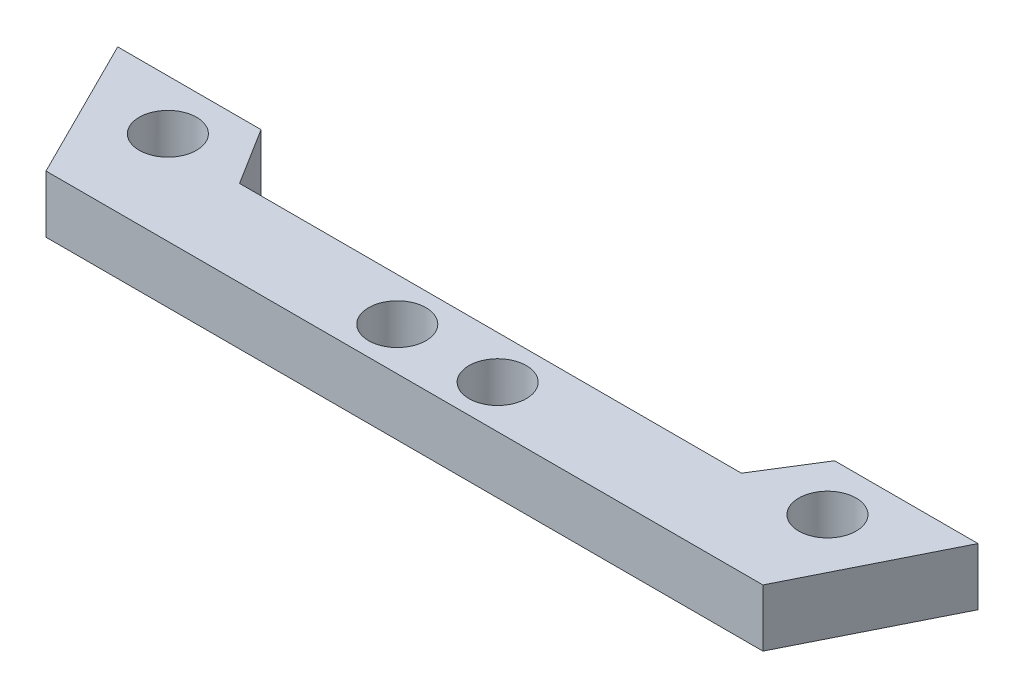
ISO-10303-21;
HEADER;
FILE_DESCRIPTION(('STEP AP214'),'2;1');
FILE_NAME('part.step','',(''),(''),'','','');
FILE_SCHEMA(('AUTOMOTIVE_DESIGN { 1 0 10303 214 1 1 1 1 }'));
ENDSEC;
DATA;
#1=APPLICATION_CONTEXT('core data for automotive mechanical design processes');
#2=APPLICATION_PROTOCOL_DEFINITION('international standard','automotive_design',2000,#1);
#3=PRODUCT_CONTEXT('',#1,'mechanical');
#4=PRODUCT('Part','Part','',(#3));
#5=PRODUCT_RELATED_PRODUCT_CATEGORY('part','',(#4));
#6=PRODUCT_DEFINITION_FORMATION('','',#4);
#7=PRODUCT_DEFINITION_CONTEXT('part definition',#1,'design');
#8=PRODUCT_DEFINITION('design','',#6,#7);
#9=PRODUCT_DEFINITION_SHAPE('','',#8);
#10=(LENGTH_UNIT() NAMED_UNIT(*) SI_UNIT(.MILLI.,.METRE.));
#11=(NAMED_UNIT(*) PLANE_ANGLE_UNIT() SI_UNIT($,.RADIAN.));
#12=(NAMED_UNIT(*) SI_UNIT($,.STERADIAN.) SOLID_ANGLE_UNIT());
#13=UNCERTAINTY_MEASURE_WITH_UNIT(LENGTH_MEASURE(1.E-05),#10,'distance_accuracy_value','');
#14=(GEOMETRIC_REPRESENTATION_CONTEXT(3) GLOBAL_UNCERTAINTY_ASSIGNED_CONTEXT((#13)) GLOBAL_UNIT_ASSIGNED_CONTEXT((#10,
#11,#12)) REPRESENTATION_CONTEXT('',''));
#15=CARTESIAN_POINT('',(0.,0.,0.));
#16=DIRECTION('',(0.,0.,1.));
#17=DIRECTION('',(1.,0.,0.));
#18=AXIS2_PLACEMENT_3D('',#15,#16,#17);
#19=CARTESIAN_POINT('',(0.,8.,0.));
#20=DIRECTION('',(0.,-1.,0.));
#21=DIRECTION('',(0.,0.,-1.));
#22=AXIS2_PLACEMENT_3D('',#19,#20,#21);
#23=PLANE('',#22);
#24=CARTESIAN_POINT('',(53.,8.,-6.));
#25=DIRECTION('',(0.,1.,0.));
#26=DIRECTION('',(0.,0.,1.));
#27=AXIS2_PLACEMENT_3D('',#24,#25,#26);
#28=CIRCLE('',#27,4.00000000000001);
#29=CARTESIAN_POINT('',(53.,8.,-2.));
#30=VERTEX_POINT('',#29);
#31=EDGE_CURVE('E204',#30,#30,#28,.T.);
#32=ORIENTED_EDGE('',*,*,#31,.F.);
#33=EDGE_LOOP('',(#32));
#34=FACE_BOUND('',#33,.T.);
#35=CARTESIAN_POINT('',(67.,8.,-6.));
#36=DIRECTION('',(0.,1.,0.));
#37=DIRECTION('',(0.,0.,1.));
#38=AXIS2_PLACEMENT_3D('',#35,#36,#37);
#39=CIRCLE('',#38,4.00000000000001);
#40=CARTESIAN_POINT('',(67.,8.,-2.));
#41=VERTEX_POINT('',#40);
#42=EDGE_CURVE('E201',#41,#41,#39,.F.);
#43=ORIENTED_EDGE('',*,*,#42,.T.);
#44=EDGE_LOOP('',(#43));
#45=FACE_BOUND('',#44,.T.);
#46=CARTESIAN_POINT('',(106.,8.,-13.));
#47=DIRECTION('',(0.,1.,0.));
#48=DIRECTION('',(0.,0.,1.));
#49=AXIS2_PLACEMENT_3D('',#46,#47,#48);
#50=CIRCLE('',#49,4.00000000000001);
#51=CARTESIAN_POINT('',(106.,8.,-9.));
#52=VERTEX_POINT('',#51);
#53=EDGE_CURVE('E198',#52,#52,#50,.F.);
#54=ORIENTED_EDGE('',*,*,#53,.T.);
#55=EDGE_LOOP('',(#54));
#56=FACE_BOUND('',#55,.T.);
#57=DIRECTION('',(-1.,0.,0.));
#58=VECTOR('',#57,1.);
#59=CARTESIAN_POINT('',(0.,8.,-20.));
#60=LINE('',#59,#58);
#61=CARTESIAN_POINT('',(20.,8.,-20.));
#62=VERTEX_POINT('',#61);
#63=CARTESIAN_POINT('',(0.,8.,-20.));
#64=VERTEX_POINT('',#63);
#65=EDGE_CURVE('E117',#62,#64,#60,.T.);
#66=ORIENTED_EDGE('',*,*,#65,.T.);
#67=DIRECTION('',(-0.447213595499958,0.,-0.894427190999916));
#68=VECTOR('',#67,1.);
#69=CARTESIAN_POINT('',(8.,8.,-4.));
#70=LINE('',#69,#68);
#71=CARTESIAN_POINT('',(10.,8.,0.));
#72=VERTEX_POINT('',#71);
#73=EDGE_CURVE('E101',#72,#64,#70,.T.);
#74=ORIENTED_EDGE('',*,*,#73,.F.);
#75=DIRECTION('',(1.,0.,0.));
#76=VECTOR('',#75,1.);
#77=CARTESIAN_POINT('',(0.,8.,0.));
#78=LINE('',#77,#76);
#79=CARTESIAN_POINT('',(110.,8.,0.));
#80=VERTEX_POINT('',#79);
#81=EDGE_CURVE('E114',#72,#80,#78,.T.);
#82=ORIENTED_EDGE('',*,*,#81,.T.);
#83=DIRECTION('',(0.447213595499958,0.,-0.894427190999916));
#84=VECTOR('',#83,1.);
#85=CARTESIAN_POINT('',(87.9999999999999,8.,44.));
#86=LINE('',#85,#84);
#87=CARTESIAN_POINT('',(120.,8.,-20.));
#88=VERTEX_POINT('',#87);
#89=EDGE_CURVE('E175',#80,#88,#86,.T.);
#90=ORIENTED_EDGE('',*,*,#89,.T.);
#91=CARTESIAN_POINT('',(100.,8.,-20.));
#92=VERTEX_POINT('',#91);
#93=EDGE_CURVE('E122',#88,#92,#60,.T.);
#94=ORIENTED_EDGE('',*,*,#93,.T.);
#95=DIRECTION('',(-0.52999894000318,0.,0.847998304005088));
#96=VECTOR('',#95,1.);
#97=CARTESIAN_POINT('',(62.9213483146068,8.,39.3258426966292));
#98=LINE('',#97,#96);
#99=CARTESIAN_POINT('',(95.,8.,-12.));
#100=VERTEX_POINT('',#99);
#101=EDGE_CURVE('E166',#92,#100,#98,.T.);
#102=ORIENTED_EDGE('',*,*,#101,.T.);
#103=DIRECTION('',(1.,0.,0.));
#104=VECTOR('',#103,1.);
#105=CARTESIAN_POINT('',(0.,8.,-12.));
#106=LINE('',#105,#104);
#107=CARTESIAN_POINT('',(25.,8.,-12.));
#108=VERTEX_POINT('',#107);
#109=EDGE_CURVE('E161',#108,#100,#106,.T.);
#110=ORIENTED_EDGE('',*,*,#109,.F.);
#111=DIRECTION('',(0.52999894000318,0.,0.847998304005088));
#112=VECTOR('',#111,1.);
#113=CARTESIAN_POINT('',(23.3707865168539,8.,-14.6067415730337));
#114=LINE('',#113,#112);
#115=EDGE_CURVE('E157',#62,#108,#114,.T.);
#116=ORIENTED_EDGE('',*,*,#115,.F.);
#117=EDGE_LOOP('',(#66,#74,#82,#90,#94,#102,#110,#116));
#118=FACE_BOUND('',#117,.T.);
#119=CARTESIAN_POINT('',(14.,8.,-13.));
#120=DIRECTION('',(0.,1.,0.));
#121=DIRECTION('',(0.,0.,1.));
#122=AXIS2_PLACEMENT_3D('',#119,#120,#121);
#123=CIRCLE('',#122,4.);
#124=CARTESIAN_POINT('',(14.,8.,-9.00000000000001));
#125=VERTEX_POINT('',#124);
#126=EDGE_CURVE('E150',#125,#125,#123,.T.);
#127=ORIENTED_EDGE('',*,*,#126,.F.);
#128=EDGE_LOOP('',(#127));
#129=FACE_BOUND('',#128,.T.);
#130=ADVANCED_FACE('F33',(#34,#45,#56,#118,#129),#23,.F.);
#131=CARTESIAN_POINT('',(0.,0.,0.));
#132=DIRECTION('',(0.,-1.,0.));
#133=DIRECTION('',(0.,0.,-1.));
#134=AXIS2_PLACEMENT_3D('',#131,#132,#133);
#135=PLANE('',#134);
#136=CARTESIAN_POINT('',(67.,0.,-6.));
#137=DIRECTION('',(0.,-1.,0.));
#138=DIRECTION('',(0.,0.,-1.));
#139=AXIS2_PLACEMENT_3D('',#136,#137,#138);
#140=CIRCLE('',#139,4.00000000000001);
#141=CARTESIAN_POINT('',(67.,0.,-10.));
#142=VERTEX_POINT('',#141);
#143=EDGE_CURVE('E149',#142,#142,#140,.F.);
#144=ORIENTED_EDGE('',*,*,#143,.T.);
#145=EDGE_LOOP('',(#144));
#146=FACE_BOUND('',#145,.T.);
#147=CARTESIAN_POINT('',(106.,0.,-13.));
#148=DIRECTION('',(0.,-1.,0.));
#149=DIRECTION('',(0.,0.,-1.));
#150=AXIS2_PLACEMENT_3D('',#147,#148,#149);
#151=CIRCLE('',#150,4.00000000000001);
#152=CARTESIAN_POINT('',(106.,0.,-17.));
#153=VERTEX_POINT('',#152);
#154=EDGE_CURVE('E146',#153,#153,#151,.F.);
#155=ORIENTED_EDGE('',*,*,#154,.T.);
#156=EDGE_LOOP('',(#155));
#157=FACE_BOUND('',#156,.T.);
#158=DIRECTION('',(0.447213595499958,0.,0.894427190999916));
#159=VECTOR('',#158,1.);
#160=CARTESIAN_POINT('',(8.,0.,-4.));
#161=LINE('',#160,#159);
#162=CARTESIAN_POINT('',(0.,0.,-20.));
#163=VERTEX_POINT('',#162);
#164=CARTESIAN_POINT('',(10.,0.,0.));
#165=VERTEX_POINT('',#164);
#166=EDGE_CURVE('E11',#163,#165,#161,.T.);
#167=ORIENTED_EDGE('',*,*,#166,.F.);
#168=DIRECTION('',(-1.,0.,0.));
#169=VECTOR('',#168,1.);
#170=CARTESIAN_POINT('',(0.,0.,-20.));
#171=LINE('',#170,#169);
#172=CARTESIAN_POINT('',(20.,0.,-20.));
#173=VERTEX_POINT('',#172);
#174=EDGE_CURVE('E125',#173,#163,#171,.T.);
#175=ORIENTED_EDGE('',*,*,#174,.F.);
#176=DIRECTION('',(-0.52999894000318,0.,-0.847998304005088));
#177=VECTOR('',#176,1.);
#178=CARTESIAN_POINT('',(23.3707865168539,0.,-14.6067415730337));
#179=LINE('',#178,#177);
#180=CARTESIAN_POINT('',(25.,0.,-12.));
#181=VERTEX_POINT('',#180);
#182=EDGE_CURVE('E143',#181,#173,#179,.T.);
#183=ORIENTED_EDGE('',*,*,#182,.F.);
#184=DIRECTION('',(-1.,0.,0.));
#185=VECTOR('',#184,1.);
#186=CARTESIAN_POINT('',(0.,0.,-12.));
#187=LINE('',#186,#185);
#188=CARTESIAN_POINT('',(95.,0.,-12.));
#189=VERTEX_POINT('',#188);
#190=EDGE_CURVE('E138',#189,#181,#187,.T.);
#191=ORIENTED_EDGE('',*,*,#190,.F.);
#192=DIRECTION('',(0.52999894000318,0.,-0.847998304005088));
#193=VECTOR('',#192,1.);
#194=CARTESIAN_POINT('',(62.9213483146068,0.,39.3258426966292));
#195=LINE('',#194,#193);
#196=CARTESIAN_POINT('',(100.,0.,-20.));
#197=VERTEX_POINT('',#196);
#198=EDGE_CURVE('E140',#189,#197,#195,.T.);
#199=ORIENTED_EDGE('',*,*,#198,.T.);
#200=CARTESIAN_POINT('',(120.,0.,-20.));
#201=VERTEX_POINT('',#200);
#202=EDGE_CURVE('E120',#201,#197,#171,.T.);
#203=ORIENTED_EDGE('',*,*,#202,.F.);
#204=DIRECTION('',(-0.447213595499958,0.,0.894427190999916));
#205=VECTOR('',#204,1.);
#206=CARTESIAN_POINT('',(87.9999999999999,0.,44.));
#207=LINE('',#206,#205);
#208=CARTESIAN_POINT('',(110.,0.,0.));
#209=VERTEX_POINT('',#208);
#210=EDGE_CURVE('E42',#201,#209,#207,.T.);
#211=ORIENTED_EDGE('',*,*,#210,.T.);
#212=DIRECTION('',(1.,0.,0.));
#213=VECTOR('',#212,1.);
#214=CARTESIAN_POINT('',(0.,0.,0.));
#215=LINE('',#214,#213);
#216=EDGE_CURVE('E108',#165,#209,#215,.T.);
#217=ORIENTED_EDGE('',*,*,#216,.F.);
#218=EDGE_LOOP('',(#167,#175,#183,#191,#199,#203,#211,#217));
#219=FACE_BOUND('',#218,.T.);
#220=CARTESIAN_POINT('',(53.,0.,-6.));
#221=DIRECTION('',(0.,-1.,0.));
#222=DIRECTION('',(0.,0.,-1.));
#223=AXIS2_PLACEMENT_3D('',#220,#221,#222);
#224=CIRCLE('',#223,4.00000000000001);
#225=CARTESIAN_POINT('',(53.,0.,-10.));
#226=VERTEX_POINT('',#225);
#227=EDGE_CURVE('E152',#226,#226,#224,.T.);
#228=ORIENTED_EDGE('',*,*,#227,.F.);
#229=EDGE_LOOP('',(#228));
#230=FACE_BOUND('',#229,.T.);
#231=CARTESIAN_POINT('',(14.,0.,-13.));
#232=DIRECTION('',(0.,-1.,0.));
#233=DIRECTION('',(0.,0.,-1.));
#234=AXIS2_PLACEMENT_3D('',#231,#232,#233);
#235=CIRCLE('',#234,4.);
#236=CARTESIAN_POINT('',(14.,0.,-17.));
#237=VERTEX_POINT('',#236);
#238=EDGE_CURVE('E37',#237,#237,#235,.T.);
#239=ORIENTED_EDGE('',*,*,#238,.F.);
#240=EDGE_LOOP('',(#239));
#241=FACE_BOUND('',#240,.T.);
#242=ADVANCED_FACE('F186',(#146,#157,#219,#230,#241),#135,.T.);
#243=CARTESIAN_POINT('',(0.,8.,0.));
#244=DIRECTION('',(0.,0.,-1.));
#245=DIRECTION('',(-1.,0.,0.));
#246=AXIS2_PLACEMENT_3D('',#243,#244,#245);
#247=PLANE('',#246);
#248=ORIENTED_EDGE('',*,*,#81,.F.);
#249=DIRECTION('',(0.,1.,0.));
#250=VECTOR('',#249,1.);
#251=CARTESIAN_POINT('',(10.,-32.,0.));
#252=LINE('',#251,#250);
#253=EDGE_CURVE('E98',#165,#72,#252,.T.);
#254=ORIENTED_EDGE('',*,*,#253,.F.);
#255=ORIENTED_EDGE('',*,*,#216,.T.);
#256=DIRECTION('',(0.,1.,0.));
#257=VECTOR('',#256,1.);
#258=CARTESIAN_POINT('',(110.,-32.,0.));
#259=LINE('',#258,#257);
#260=EDGE_CURVE('E58',#209,#80,#259,.T.);
#261=ORIENTED_EDGE('',*,*,#260,.T.);
#262=EDGE_LOOP('',(#248,#254,#255,#261));
#263=FACE_BOUND('',#262,.T.);
#264=ADVANCED_FACE('F35',(#263),#247,.F.);
#265=CARTESIAN_POINT('',(0.,8.,-20.));
#266=DIRECTION('',(0.,0.,1.));
#267=DIRECTION('',(1.,0.,0.));
#268=AXIS2_PLACEMENT_3D('',#265,#266,#267);
#269=PLANE('',#268);
#270=DIRECTION('',(0.,1.,0.));
#271=VECTOR('',#270,1.);
#272=CARTESIAN_POINT('',(100.,-32.,-20.));
#273=LINE('',#272,#271);
#274=EDGE_CURVE('E176',#197,#92,#273,.T.);
#275=ORIENTED_EDGE('',*,*,#274,.T.);
#276=ORIENTED_EDGE('',*,*,#93,.F.);
#277=DIRECTION('',(0.,-1.,0.));
#278=VECTOR('',#277,1.);
#279=CARTESIAN_POINT('',(120.,8.,-20.));
#280=LINE('',#279,#278);
#281=EDGE_CURVE('E135',#88,#201,#280,.T.);
#282=ORIENTED_EDGE('',*,*,#281,.T.);
#283=ORIENTED_EDGE('',*,*,#202,.T.);
#284=EDGE_LOOP('',(#275,#276,#282,#283));
#285=FACE_BOUND('',#284,.T.);
#286=ADVANCED_FACE('F194',(#285),#269,.F.);
#287=ORIENTED_EDGE('',*,*,#65,.F.);
#288=DIRECTION('',(0.,1.,0.));
#289=VECTOR('',#288,1.);
#290=CARTESIAN_POINT('',(20.,-32.,-20.));
#291=LINE('',#290,#289);
#292=EDGE_CURVE('E173',#173,#62,#291,.T.);
#293=ORIENTED_EDGE('',*,*,#292,.F.);
#294=ORIENTED_EDGE('',*,*,#174,.T.);
#295=DIRECTION('',(0.,-1.,0.));
#296=VECTOR('',#295,1.);
#297=CARTESIAN_POINT('',(0.,8.,-20.));
#298=LINE('',#297,#296);
#299=EDGE_CURVE('E132',#64,#163,#298,.T.);
#300=ORIENTED_EDGE('',*,*,#299,.F.);
#301=EDGE_LOOP('',(#287,#293,#294,#300));
#302=FACE_BOUND('',#301,.T.);
#303=ADVANCED_FACE('F190',(#302),#269,.F.);
#304=CARTESIAN_POINT('',(23.3707865168539,-32.,-14.6067415730337));
#305=DIRECTION('',(-0.847998304005088,0.,0.52999894000318));
#306=DIRECTION('',(0.52999894000318,0.,0.847998304005088));
#307=AXIS2_PLACEMENT_3D('',#304,#305,#306);
#308=PLANE('',#307);
#309=ORIENTED_EDGE('',*,*,#182,.T.);
#310=ORIENTED_EDGE('',*,*,#292,.T.);
#311=ORIENTED_EDGE('',*,*,#115,.T.);
#312=DIRECTION('',(0.,1.,0.));
#313=VECTOR('',#312,1.);
#314=CARTESIAN_POINT('',(25.,-32.,-12.));
#315=LINE('',#314,#313);
#316=EDGE_CURVE('E128',#181,#108,#315,.T.);
#317=ORIENTED_EDGE('',*,*,#316,.F.);
#318=EDGE_LOOP('',(#309,#310,#311,#317));
#319=FACE_BOUND('',#318,.T.);
#320=ADVANCED_FACE('F182',(#319),#308,.F.);
#321=CARTESIAN_POINT('',(62.9213483146068,-32.,39.3258426966292));
#322=DIRECTION('',(-0.847998304005088,0.,-0.52999894000318));
#323=DIRECTION('',(-0.52999894000318,0.,0.847998304005088));
#324=AXIS2_PLACEMENT_3D('',#321,#322,#323);
#325=PLANE('',#324);
#326=DIRECTION('',(0.,1.,0.));
#327=VECTOR('',#326,1.);
#328=CARTESIAN_POINT('',(95.,-32.,-12.));
#329=LINE('',#328,#327);
#330=EDGE_CURVE('E50',#189,#100,#329,.T.);
#331=ORIENTED_EDGE('',*,*,#330,.T.);
#332=ORIENTED_EDGE('',*,*,#101,.F.);
#333=ORIENTED_EDGE('',*,*,#274,.F.);
#334=ORIENTED_EDGE('',*,*,#198,.F.);
#335=EDGE_LOOP('',(#331,#332,#333,#334));
#336=FACE_BOUND('',#335,.T.);
#337=ADVANCED_FACE('F192',(#336),#325,.T.);
#338=CARTESIAN_POINT('',(0.,-32.,-12.));
#339=DIRECTION('',(0.,0.,1.));
#340=DIRECTION('',(1.,0.,0.));
#341=AXIS2_PLACEMENT_3D('',#338,#339,#340);
#342=PLANE('',#341);
#343=ORIENTED_EDGE('',*,*,#190,.T.);
#344=ORIENTED_EDGE('',*,*,#316,.T.);
#345=ORIENTED_EDGE('',*,*,#109,.T.);
#346=ORIENTED_EDGE('',*,*,#330,.F.);
#347=EDGE_LOOP('',(#343,#344,#345,#346));
#348=FACE_BOUND('',#347,.T.);
#349=ADVANCED_FACE('F179',(#348),#342,.F.);
#350=CARTESIAN_POINT('',(87.9999999999999,-32.,44.));
#351=DIRECTION('',(0.894427190999916,0.,0.447213595499958));
#352=DIRECTION('',(0.447213595499958,0.,-0.894427190999916));
#353=AXIS2_PLACEMENT_3D('',#350,#351,#352);
#354=PLANE('',#353);
#355=ORIENTED_EDGE('',*,*,#281,.F.);
#356=ORIENTED_EDGE('',*,*,#89,.F.);
#357=ORIENTED_EDGE('',*,*,#260,.F.);
#358=ORIENTED_EDGE('',*,*,#210,.F.);
#359=EDGE_LOOP('',(#355,#356,#357,#358));
#360=FACE_BOUND('',#359,.T.);
#361=ADVANCED_FACE('F196',(#360),#354,.T.);
#362=CARTESIAN_POINT('',(8.,-32.,-4.));
#363=DIRECTION('',(0.894427190999916,0.,-0.447213595499958));
#364=DIRECTION('',(-0.447213595499958,0.,-0.894427190999916));
#365=AXIS2_PLACEMENT_3D('',#362,#363,#364);
#366=PLANE('',#365);
#367=ORIENTED_EDGE('',*,*,#166,.T.);
#368=ORIENTED_EDGE('',*,*,#253,.T.);
#369=ORIENTED_EDGE('',*,*,#73,.T.);
#370=ORIENTED_EDGE('',*,*,#299,.T.);
#371=EDGE_LOOP('',(#367,#368,#369,#370));
#372=FACE_BOUND('',#371,.T.);
#373=ADVANCED_FACE('F100',(#372),#366,.F.);
#374=CARTESIAN_POINT('',(106.,-2.,-13.));
#375=DIRECTION('',(0.,1.,0.));
#376=DIRECTION('',(0.,0.,1.));
#377=AXIS2_PLACEMENT_3D('',#374,#375,#376);
#378=CYLINDRICAL_SURFACE('',#377,4.00000000000001);
#379=ORIENTED_EDGE('',*,*,#154,.F.);
#380=EDGE_LOOP('',(#379));
#381=FACE_BOUND('',#380,.T.);
#382=ORIENTED_EDGE('',*,*,#53,.F.);
#383=EDGE_LOOP('',(#382));
#384=FACE_BOUND('',#383,.T.);
#385=ADVANCED_FACE('F246',(#381,#384),#378,.F.);
#386=CARTESIAN_POINT('',(67.,-2.,-6.));
#387=DIRECTION('',(0.,1.,0.));
#388=DIRECTION('',(0.,0.,1.));
#389=AXIS2_PLACEMENT_3D('',#386,#387,#388);
#390=CYLINDRICAL_SURFACE('',#389,4.00000000000001);
#391=ORIENTED_EDGE('',*,*,#143,.F.);
#392=EDGE_LOOP('',(#391));
#393=FACE_BOUND('',#392,.T.);
#394=ORIENTED_EDGE('',*,*,#42,.F.);
#395=EDGE_LOOP('',(#394));
#396=FACE_BOUND('',#395,.T.);
#397=ADVANCED_FACE('F251',(#393,#396),#390,.F.);
#398=CARTESIAN_POINT('',(53.,-2.,-6.));
#399=DIRECTION('',(0.,1.,0.));
#400=DIRECTION('',(0.,0.,1.));
#401=AXIS2_PLACEMENT_3D('',#398,#399,#400);
#402=CYLINDRICAL_SURFACE('',#401,4.00000000000001);
#403=ORIENTED_EDGE('',*,*,#227,.T.);
#404=EDGE_LOOP('',(#403));
#405=FACE_BOUND('',#404,.T.);
#406=ORIENTED_EDGE('',*,*,#31,.T.);
#407=EDGE_LOOP('',(#406));
#408=FACE_BOUND('',#407,.T.);
#409=ADVANCED_FACE('F262',(#405,#408),#402,.F.);
#410=CARTESIAN_POINT('',(14.,-2.,-13.));
#411=DIRECTION('',(0.,1.,0.));
#412=DIRECTION('',(0.,0.,1.));
#413=AXIS2_PLACEMENT_3D('',#410,#411,#412);
#414=CYLINDRICAL_SURFACE('',#413,4.);
#415=ORIENTED_EDGE('',*,*,#238,.T.);
#416=EDGE_LOOP('',(#415));
#417=FACE_BOUND('',#416,.T.);
#418=ORIENTED_EDGE('',*,*,#126,.T.);
#419=EDGE_LOOP('',(#418));
#420=FACE_BOUND('',#419,.T.);
#421=ADVANCED_FACE('F210',(#417,#420),#414,.F.);
#422=CLOSED_SHELL('',(#130,#242,#264,#286,#303,#320,#337,#349,#361,#373,#385,#397,#409,#421));
#423=MANIFOLD_SOLID_BREP('B2',#422);
#424=ADVANCED_BREP_SHAPE_REPRESENTATION('',(#18,#423),#14);
#425=SHAPE_DEFINITION_REPRESENTATION(#9,#424);
ENDSEC;
END-ISO-10303-21;
